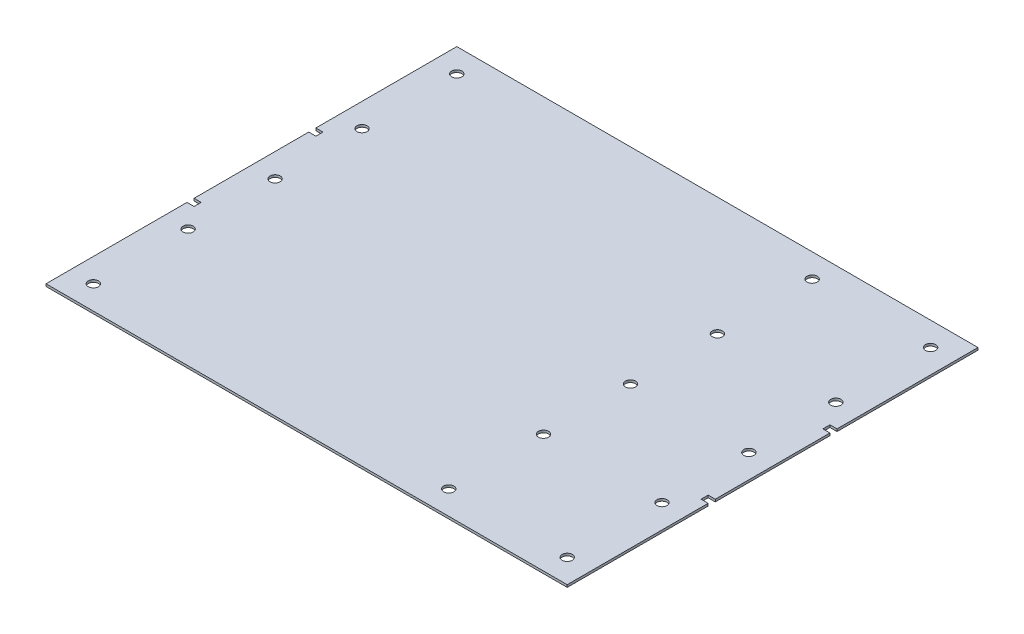
ISO-10303-21;
HEADER;
FILE_DESCRIPTION(('STEP AP214'),'2;1');
FILE_NAME('part.step','',(''),(''),'','','');
FILE_SCHEMA(('AUTOMOTIVE_DESIGN { 1 0 10303 214 1 1 1 1 }'));
ENDSEC;
DATA;
#1=APPLICATION_CONTEXT('core data for automotive mechanical design processes');
#2=APPLICATION_PROTOCOL_DEFINITION('international standard','automotive_design',2000,#1);
#3=PRODUCT_CONTEXT('',#1,'mechanical');
#4=PRODUCT('Part','Part','',(#3));
#5=PRODUCT_RELATED_PRODUCT_CATEGORY('part','',(#4));
#6=PRODUCT_DEFINITION_FORMATION('','',#4);
#7=PRODUCT_DEFINITION_CONTEXT('part definition',#1,'design');
#8=PRODUCT_DEFINITION('design','',#6,#7);
#9=PRODUCT_DEFINITION_SHAPE('','',#8);
#10=(LENGTH_UNIT() NAMED_UNIT(*) SI_UNIT(.MILLI.,.METRE.));
#11=(NAMED_UNIT(*) PLANE_ANGLE_UNIT() SI_UNIT($,.RADIAN.));
#12=(NAMED_UNIT(*) SI_UNIT($,.STERADIAN.) SOLID_ANGLE_UNIT());
#13=UNCERTAINTY_MEASURE_WITH_UNIT(LENGTH_MEASURE(1.E-05),#10,'distance_accuracy_value','');
#14=(GEOMETRIC_REPRESENTATION_CONTEXT(3) GLOBAL_UNCERTAINTY_ASSIGNED_CONTEXT((#13)) GLOBAL_UNIT_ASSIGNED_CONTEXT((#10,
#11,#12)) REPRESENTATION_CONTEXT('',''));
#15=CARTESIAN_POINT('',(0.,0.,0.));
#16=DIRECTION('',(0.,0.,1.));
#17=DIRECTION('',(1.,0.,0.));
#18=AXIS2_PLACEMENT_3D('',#15,#16,#17);
#19=CARTESIAN_POINT('',(207.,1.,1.91513471747838E-12));
#20=DIRECTION('',(1.,0.,0.));
#21=DIRECTION('',(0.,0.,-1.));
#22=AXIS2_PLACEMENT_3D('',#19,#20,#21);
#23=PLANE('',#22);
#24=DIRECTION('',(0.,0.,1.));
#25=VECTOR('',#24,1.);
#26=CARTESIAN_POINT('',(207.,0.,1.91513471747838E-12));
#27=LINE('',#26,#25);
#28=CARTESIAN_POINT('',(207.,0.,24.2));
#29=VERTEX_POINT('',#28);
#30=CARTESIAN_POINT('',(207.,0.,27.2));
#31=VERTEX_POINT('',#30);
#32=EDGE_CURVE('E251',#29,#31,#27,.T.);
#33=ORIENTED_EDGE('',*,*,#32,.F.);
#34=DIRECTION('',(0.,-1.,0.));
#35=VECTOR('',#34,1.);
#36=CARTESIAN_POINT('',(207.,1.,24.2));
#37=LINE('',#36,#35);
#38=CARTESIAN_POINT('',(207.,1.,24.2));
#39=VERTEX_POINT('',#38);
#40=EDGE_CURVE('E11',#39,#29,#37,.T.);
#41=ORIENTED_EDGE('',*,*,#40,.F.);
#42=DIRECTION('',(0.,0.,1.));
#43=VECTOR('',#42,1.);
#44=CARTESIAN_POINT('',(207.,1.,1.91513471747838E-12));
#45=LINE('',#44,#43);
#46=CARTESIAN_POINT('',(207.,1.,27.2));
#47=VERTEX_POINT('',#46);
#48=EDGE_CURVE('E820',#39,#47,#45,.T.);
#49=ORIENTED_EDGE('',*,*,#48,.T.);
#50=DIRECTION('',(0.,-1.,0.));
#51=VECTOR('',#50,1.);
#52=CARTESIAN_POINT('',(207.,1.,27.2));
#53=LINE('',#52,#51);
#54=EDGE_CURVE('E53',#47,#31,#53,.T.);
#55=ORIENTED_EDGE('',*,*,#54,.T.);
#56=EDGE_LOOP('',(#33,#41,#49,#55));
#57=FACE_BOUND('',#56,.T.);
#58=ADVANCED_FACE('F36',(#57),#23,.T.);
#59=CARTESIAN_POINT('',(0.,1.,24.2));
#60=DIRECTION('',(0.,0.,1.));
#61=DIRECTION('',(1.,0.,0.));
#62=AXIS2_PLACEMENT_3D('',#59,#60,#61);
#63=PLANE('',#62);
#64=DIRECTION('',(-1.,0.,0.));
#65=VECTOR('',#64,1.);
#66=CARTESIAN_POINT('',(0.,0.,24.2));
#67=LINE('',#66,#65);
#68=CARTESIAN_POINT('',(210.,0.,24.2));
#69=VERTEX_POINT('',#68);
#70=EDGE_CURVE('E248',#69,#29,#67,.T.);
#71=ORIENTED_EDGE('',*,*,#70,.F.);
#72=DIRECTION('',(0.,-1.,0.));
#73=VECTOR('',#72,1.);
#74=CARTESIAN_POINT('',(210.,1.,24.2));
#75=LINE('',#74,#73);
#76=CARTESIAN_POINT('',(210.,1.,24.2));
#77=VERTEX_POINT('',#76);
#78=EDGE_CURVE('E45',#77,#69,#75,.T.);
#79=ORIENTED_EDGE('',*,*,#78,.F.);
#80=DIRECTION('',(-1.,0.,0.));
#81=VECTOR('',#80,1.);
#82=CARTESIAN_POINT('',(0.,1.,24.2));
#83=LINE('',#82,#81);
#84=EDGE_CURVE('E818',#77,#39,#83,.T.);
#85=ORIENTED_EDGE('',*,*,#84,.T.);
#86=ORIENTED_EDGE('',*,*,#40,.T.);
#87=EDGE_LOOP('',(#71,#79,#85,#86));
#88=FACE_BOUND('',#87,.T.);
#89=ADVANCED_FACE('F249',(#88),#63,.T.);
#90=CARTESIAN_POINT('',(210.,1.,0.));
#91=DIRECTION('',(1.,0.,0.));
#92=DIRECTION('',(0.,0.,-1.));
#93=AXIS2_PLACEMENT_3D('',#90,#91,#92);
#94=PLANE('',#93);
#95=DIRECTION('',(0.,0.,1.));
#96=VECTOR('',#95,1.);
#97=CARTESIAN_POINT('',(210.,0.,0.));
#98=LINE('',#97,#96);
#99=CARTESIAN_POINT('',(210.,0.,-24.2));
#100=VERTEX_POINT('',#99);
#101=EDGE_CURVE('E240',#100,#69,#98,.T.);
#102=ORIENTED_EDGE('',*,*,#101,.F.);
#103=DIRECTION('',(0.,-1.,0.));
#104=VECTOR('',#103,1.);
#105=CARTESIAN_POINT('',(210.,1.,-24.2));
#106=LINE('',#105,#104);
#107=CARTESIAN_POINT('',(210.,1.,-24.2));
#108=VERTEX_POINT('',#107);
#109=EDGE_CURVE('E233',#108,#100,#106,.T.);
#110=ORIENTED_EDGE('',*,*,#109,.F.);
#111=DIRECTION('',(0.,0.,1.));
#112=VECTOR('',#111,1.);
#113=CARTESIAN_POINT('',(210.,1.,0.));
#114=LINE('',#113,#112);
#115=EDGE_CURVE('E243',#108,#77,#114,.T.);
#116=ORIENTED_EDGE('',*,*,#115,.T.);
#117=ORIENTED_EDGE('',*,*,#78,.T.);
#118=EDGE_LOOP('',(#102,#110,#116,#117));
#119=FACE_BOUND('',#118,.T.);
#120=ADVANCED_FACE('F238',(#119),#94,.T.);
#121=CARTESIAN_POINT('',(0.,1.,-24.2));
#122=DIRECTION('',(0.,0.,-1.));
#123=DIRECTION('',(-1.,0.,0.));
#124=AXIS2_PLACEMENT_3D('',#121,#122,#123);
#125=PLANE('',#124);
#126=DIRECTION('',(1.,0.,0.));
#127=VECTOR('',#126,1.);
#128=CARTESIAN_POINT('',(0.,0.,-24.2));
#129=LINE('',#128,#127);
#130=CARTESIAN_POINT('',(207.,0.,-24.2));
#131=VERTEX_POINT('',#130);
#132=EDGE_CURVE('E256',#131,#100,#129,.T.);
#133=ORIENTED_EDGE('',*,*,#132,.F.);
#134=DIRECTION('',(0.,-1.,0.));
#135=VECTOR('',#134,1.);
#136=CARTESIAN_POINT('',(207.,1.,-24.2));
#137=LINE('',#136,#135);
#138=CARTESIAN_POINT('',(207.,1.,-24.2));
#139=VERTEX_POINT('',#138);
#140=EDGE_CURVE('E231',#139,#131,#137,.T.);
#141=ORIENTED_EDGE('',*,*,#140,.F.);
#142=DIRECTION('',(1.,0.,0.));
#143=VECTOR('',#142,1.);
#144=CARTESIAN_POINT('',(0.,1.,-24.2));
#145=LINE('',#144,#143);
#146=EDGE_CURVE('E765',#139,#108,#145,.T.);
#147=ORIENTED_EDGE('',*,*,#146,.T.);
#148=ORIENTED_EDGE('',*,*,#109,.T.);
#149=EDGE_LOOP('',(#133,#141,#147,#148));
#150=FACE_BOUND('',#149,.T.);
#151=ADVANCED_FACE('F724',(#150),#125,.T.);
#152=CARTESIAN_POINT('',(207.,1.,-1.91513471747838E-12));
#153=DIRECTION('',(1.,0.,0.));
#154=DIRECTION('',(0.,0.,-1.));
#155=AXIS2_PLACEMENT_3D('',#152,#153,#154);
#156=PLANE('',#155);
#157=DIRECTION('',(0.,0.,1.));
#158=VECTOR('',#157,1.);
#159=CARTESIAN_POINT('',(207.,0.,-1.91513471747838E-12));
#160=LINE('',#159,#158);
#161=CARTESIAN_POINT('',(207.,0.,-27.2));
#162=VERTEX_POINT('',#161);
#163=EDGE_CURVE('E258',#162,#131,#160,.T.);
#164=ORIENTED_EDGE('',*,*,#163,.F.);
#165=DIRECTION('',(0.,-1.,0.));
#166=VECTOR('',#165,1.);
#167=CARTESIAN_POINT('',(207.,1.,-27.2));
#168=LINE('',#167,#166);
#169=CARTESIAN_POINT('',(207.,1.,-27.2));
#170=VERTEX_POINT('',#169);
#171=EDGE_CURVE('E229',#170,#162,#168,.T.);
#172=ORIENTED_EDGE('',*,*,#171,.F.);
#173=DIRECTION('',(0.,0.,1.));
#174=VECTOR('',#173,1.);
#175=CARTESIAN_POINT('',(207.,1.,-1.91513471747838E-12));
#176=LINE('',#175,#174);
#177=EDGE_CURVE('E761',#170,#139,#176,.T.);
#178=ORIENTED_EDGE('',*,*,#177,.T.);
#179=ORIENTED_EDGE('',*,*,#140,.T.);
#180=EDGE_LOOP('',(#164,#172,#178,#179));
#181=FACE_BOUND('',#180,.T.);
#182=ADVANCED_FACE('F714',(#181),#156,.T.);
#183=CARTESIAN_POINT('',(-2.20194233217307E-13,1.,-27.1999999999984));
#184=DIRECTION('',(0.,0.,1.));
#185=DIRECTION('',(1.,0.,0.));
#186=AXIS2_PLACEMENT_3D('',#183,#184,#185);
#187=PLANE('',#186);
#188=DIRECTION('',(-1.,0.,0.));
#189=VECTOR('',#188,1.);
#190=CARTESIAN_POINT('',(-2.20194233217307E-13,0.,-27.1999999999984));
#191=LINE('',#190,#189);
#192=CARTESIAN_POINT('',(210.,0.,-27.2000000000001));
#193=VERTEX_POINT('',#192);
#194=EDGE_CURVE('E263',#193,#162,#191,.T.);
#195=ORIENTED_EDGE('',*,*,#194,.F.);
#196=DIRECTION('',(0.,-1.,0.));
#197=VECTOR('',#196,1.);
#198=CARTESIAN_POINT('',(210.,1.,-27.2000000000001));
#199=LINE('',#198,#197);
#200=CARTESIAN_POINT('',(210.,1.,-27.2000000000001));
#201=VERTEX_POINT('',#200);
#202=EDGE_CURVE('E227',#201,#193,#199,.T.);
#203=ORIENTED_EDGE('',*,*,#202,.F.);
#204=DIRECTION('',(-1.,0.,0.));
#205=VECTOR('',#204,1.);
#206=CARTESIAN_POINT('',(-2.20194233217307E-13,1.,-27.1999999999984));
#207=LINE('',#206,#205);
#208=EDGE_CURVE('E764',#201,#170,#207,.T.);
#209=ORIENTED_EDGE('',*,*,#208,.T.);
#210=ORIENTED_EDGE('',*,*,#171,.T.);
#211=EDGE_LOOP('',(#195,#203,#209,#210));
#212=FACE_BOUND('',#211,.T.);
#213=ADVANCED_FACE('F704',(#212),#187,.T.);
#214=CARTESIAN_POINT('',(210.,1.,-1.95921710227969E-13));
#215=DIRECTION('',(1.,0.,0.));
#216=DIRECTION('',(0.,0.,-1.));
#217=AXIS2_PLACEMENT_3D('',#214,#215,#216);
#218=PLANE('',#217);
#219=DIRECTION('',(0.,0.,1.));
#220=VECTOR('',#219,1.);
#221=CARTESIAN_POINT('',(210.,0.,-1.95921710227969E-13));
#222=LINE('',#221,#220);
#223=CARTESIAN_POINT('',(210.,0.,-86.7000000000001));
#224=VERTEX_POINT('',#223);
#225=EDGE_CURVE('E266',#224,#193,#222,.T.);
#226=ORIENTED_EDGE('',*,*,#225,.F.);
#227=DIRECTION('',(0.,-1.,0.));
#228=VECTOR('',#227,1.);
#229=CARTESIAN_POINT('',(210.,1.,-86.7000000000001));
#230=LINE('',#229,#228);
#231=CARTESIAN_POINT('',(210.,1.,-86.7000000000001));
#232=VERTEX_POINT('',#231);
#233=EDGE_CURVE('E225',#232,#224,#230,.T.);
#234=ORIENTED_EDGE('',*,*,#233,.F.);
#235=DIRECTION('',(0.,0.,1.));
#236=VECTOR('',#235,1.);
#237=CARTESIAN_POINT('',(210.,1.,-1.95921710227969E-13));
#238=LINE('',#237,#236);
#239=EDGE_CURVE('E767',#232,#201,#238,.T.);
#240=ORIENTED_EDGE('',*,*,#239,.T.);
#241=ORIENTED_EDGE('',*,*,#202,.T.);
#242=EDGE_LOOP('',(#226,#234,#240,#241));
#243=FACE_BOUND('',#242,.T.);
#244=ADVANCED_FACE('F694',(#243),#218,.T.);
#245=CARTESIAN_POINT('',(0.,1.,-86.7));
#246=DIRECTION('',(0.,0.,-1.));
#247=DIRECTION('',(-1.,0.,0.));
#248=AXIS2_PLACEMENT_3D('',#245,#246,#247);
#249=PLANE('',#248);
#250=DIRECTION('',(1.,0.,0.));
#251=VECTOR('',#250,1.);
#252=CARTESIAN_POINT('',(0.,0.,-86.7));
#253=LINE('',#252,#251);
#254=CARTESIAN_POINT('',(-10.,0.,-86.7));
#255=VERTEX_POINT('',#254);
#256=EDGE_CURVE('E269',#255,#224,#253,.T.);
#257=ORIENTED_EDGE('',*,*,#256,.F.);
#258=DIRECTION('',(0.,-1.,0.));
#259=VECTOR('',#258,1.);
#260=CARTESIAN_POINT('',(-10.,1.,-86.7));
#261=LINE('',#260,#259);
#262=CARTESIAN_POINT('',(-10.,1.,-86.7));
#263=VERTEX_POINT('',#262);
#264=EDGE_CURVE('E223',#263,#255,#261,.T.);
#265=ORIENTED_EDGE('',*,*,#264,.F.);
#266=DIRECTION('',(1.,0.,0.));
#267=VECTOR('',#266,1.);
#268=CARTESIAN_POINT('',(0.,1.,-86.7));
#269=LINE('',#268,#267);
#270=EDGE_CURVE('E774',#263,#232,#269,.T.);
#271=ORIENTED_EDGE('',*,*,#270,.T.);
#272=ORIENTED_EDGE('',*,*,#233,.T.);
#273=EDGE_LOOP('',(#257,#265,#271,#272));
#274=FACE_BOUND('',#273,.T.);
#275=ADVANCED_FACE('F684',(#274),#249,.T.);
#276=CARTESIAN_POINT('',(-10.,1.,0.));
#277=DIRECTION('',(-1.,0.,0.));
#278=DIRECTION('',(0.,0.,1.));
#279=AXIS2_PLACEMENT_3D('',#276,#277,#278);
#280=PLANE('',#279);
#281=DIRECTION('',(0.,0.,-1.));
#282=VECTOR('',#281,1.);
#283=CARTESIAN_POINT('',(-10.,0.,0.));
#284=LINE('',#283,#282);
#285=CARTESIAN_POINT('',(-10.,0.,-27.2));
#286=VERTEX_POINT('',#285);
#287=EDGE_CURVE('E272',#286,#255,#284,.T.);
#288=ORIENTED_EDGE('',*,*,#287,.F.);
#289=DIRECTION('',(0.,-1.,0.));
#290=VECTOR('',#289,1.);
#291=CARTESIAN_POINT('',(-10.,1.,-27.2));
#292=LINE('',#291,#290);
#293=CARTESIAN_POINT('',(-10.,1.,-27.2));
#294=VERTEX_POINT('',#293);
#295=EDGE_CURVE('E221',#294,#286,#292,.T.);
#296=ORIENTED_EDGE('',*,*,#295,.F.);
#297=DIRECTION('',(0.,0.,-1.));
#298=VECTOR('',#297,1.);
#299=CARTESIAN_POINT('',(-10.,1.,0.));
#300=LINE('',#299,#298);
#301=EDGE_CURVE('E777',#294,#263,#300,.T.);
#302=ORIENTED_EDGE('',*,*,#301,.T.);
#303=ORIENTED_EDGE('',*,*,#264,.T.);
#304=EDGE_LOOP('',(#288,#296,#302,#303));
#305=FACE_BOUND('',#304,.T.);
#306=ADVANCED_FACE('F674',(#305),#280,.T.);
#307=CARTESIAN_POINT('',(0.,1.,-27.2));
#308=DIRECTION('',(0.,0.,1.));
#309=DIRECTION('',(1.,0.,0.));
#310=AXIS2_PLACEMENT_3D('',#307,#308,#309);
#311=PLANE('',#310);
#312=DIRECTION('',(-1.,0.,0.));
#313=VECTOR('',#312,1.);
#314=CARTESIAN_POINT('',(0.,0.,-27.2));
#315=LINE('',#314,#313);
#316=CARTESIAN_POINT('',(-7.,0.,-27.2));
#317=VERTEX_POINT('',#316);
#318=EDGE_CURVE('E275',#317,#286,#315,.T.);
#319=ORIENTED_EDGE('',*,*,#318,.F.);
#320=DIRECTION('',(0.,-1.,0.));
#321=VECTOR('',#320,1.);
#322=CARTESIAN_POINT('',(-7.,1.,-27.2));
#323=LINE('',#322,#321);
#324=CARTESIAN_POINT('',(-7.,1.,-27.2));
#325=VERTEX_POINT('',#324);
#326=EDGE_CURVE('E219',#325,#317,#323,.T.);
#327=ORIENTED_EDGE('',*,*,#326,.F.);
#328=DIRECTION('',(-1.,0.,0.));
#329=VECTOR('',#328,1.);
#330=CARTESIAN_POINT('',(0.,1.,-27.2));
#331=LINE('',#330,#329);
#332=EDGE_CURVE('E780',#325,#294,#331,.T.);
#333=ORIENTED_EDGE('',*,*,#332,.T.);
#334=ORIENTED_EDGE('',*,*,#295,.T.);
#335=EDGE_LOOP('',(#319,#327,#333,#334));
#336=FACE_BOUND('',#335,.T.);
#337=ADVANCED_FACE('F664',(#336),#311,.T.);
#338=CARTESIAN_POINT('',(-6.99999999999999,1.,0.));
#339=DIRECTION('',(1.,0.,0.));
#340=DIRECTION('',(0.,0.,-1.));
#341=AXIS2_PLACEMENT_3D('',#338,#339,#340);
#342=PLANE('',#341);
#343=DIRECTION('',(0.,0.,1.));
#344=VECTOR('',#343,1.);
#345=CARTESIAN_POINT('',(-6.99999999999999,0.,0.));
#346=LINE('',#345,#344);
#347=CARTESIAN_POINT('',(-7.,0.,-24.2));
#348=VERTEX_POINT('',#347);
#349=EDGE_CURVE('E278',#317,#348,#346,.T.);
#350=ORIENTED_EDGE('',*,*,#349,.T.);
#351=DIRECTION('',(0.,-1.,0.));
#352=VECTOR('',#351,1.);
#353=CARTESIAN_POINT('',(-7.,1.,-24.2));
#354=LINE('',#353,#352);
#355=CARTESIAN_POINT('',(-7.,1.,-24.2));
#356=VERTEX_POINT('',#355);
#357=EDGE_CURVE('E216',#356,#348,#354,.T.);
#358=ORIENTED_EDGE('',*,*,#357,.F.);
#359=DIRECTION('',(0.,0.,1.));
#360=VECTOR('',#359,1.);
#361=CARTESIAN_POINT('',(-6.99999999999999,1.,0.));
#362=LINE('',#361,#360);
#363=EDGE_CURVE('E783',#325,#356,#362,.T.);
#364=ORIENTED_EDGE('',*,*,#363,.F.);
#365=ORIENTED_EDGE('',*,*,#326,.T.);
#366=EDGE_LOOP('',(#350,#358,#364,#365));
#367=FACE_BOUND('',#366,.T.);
#368=ADVANCED_FACE('F654',(#367),#342,.F.);
#369=CARTESIAN_POINT('',(-6.15711185740036E-13,1.,-24.2000000000002));
#370=DIRECTION('',(0.,0.,1.));
#371=DIRECTION('',(1.,0.,0.));
#372=AXIS2_PLACEMENT_3D('',#369,#370,#371);
#373=PLANE('',#372);
#374=DIRECTION('',(-1.,0.,0.));
#375=VECTOR('',#374,1.);
#376=CARTESIAN_POINT('',(-6.15711185740036E-13,0.,-24.2000000000002));
#377=LINE('',#376,#375);
#378=CARTESIAN_POINT('',(-10.,0.,-24.2));
#379=VERTEX_POINT('',#378);
#380=EDGE_CURVE('E281',#348,#379,#377,.T.);
#381=ORIENTED_EDGE('',*,*,#380,.T.);
#382=DIRECTION('',(0.,-1.,0.));
#383=VECTOR('',#382,1.);
#384=CARTESIAN_POINT('',(-10.,1.,-24.2));
#385=LINE('',#384,#383);
#386=CARTESIAN_POINT('',(-10.,1.,-24.2));
#387=VERTEX_POINT('',#386);
#388=EDGE_CURVE('E213',#387,#379,#385,.T.);
#389=ORIENTED_EDGE('',*,*,#388,.F.);
#390=DIRECTION('',(-1.,0.,0.));
#391=VECTOR('',#390,1.);
#392=CARTESIAN_POINT('',(-6.15711185740036E-13,1.,-24.2000000000002));
#393=LINE('',#392,#391);
#394=EDGE_CURVE('E786',#356,#387,#393,.T.);
#395=ORIENTED_EDGE('',*,*,#394,.F.);
#396=ORIENTED_EDGE('',*,*,#357,.T.);
#397=EDGE_LOOP('',(#381,#389,#395,#396));
#398=FACE_BOUND('',#397,.T.);
#399=ADVANCED_FACE('F644',(#398),#373,.F.);
#400=CARTESIAN_POINT('',(-10.,1.,0.));
#401=DIRECTION('',(1.,0.,0.));
#402=DIRECTION('',(0.,0.,-1.));
#403=AXIS2_PLACEMENT_3D('',#400,#401,#402);
#404=PLANE('',#403);
#405=DIRECTION('',(0.,0.,1.));
#406=VECTOR('',#405,1.);
#407=CARTESIAN_POINT('',(-10.,0.,0.));
#408=LINE('',#407,#406);
#409=CARTESIAN_POINT('',(-10.,0.,24.2));
#410=VERTEX_POINT('',#409);
#411=EDGE_CURVE('E284',#379,#410,#408,.T.);
#412=ORIENTED_EDGE('',*,*,#411,.T.);
#413=DIRECTION('',(0.,-1.,0.));
#414=VECTOR('',#413,1.);
#415=CARTESIAN_POINT('',(-10.,1.,24.2));
#416=LINE('',#415,#414);
#417=CARTESIAN_POINT('',(-10.,1.,24.2));
#418=VERTEX_POINT('',#417);
#419=EDGE_CURVE('E210',#418,#410,#416,.T.);
#420=ORIENTED_EDGE('',*,*,#419,.F.);
#421=DIRECTION('',(0.,0.,1.));
#422=VECTOR('',#421,1.);
#423=CARTESIAN_POINT('',(-10.,1.,0.));
#424=LINE('',#423,#422);
#425=EDGE_CURVE('E789',#387,#418,#424,.T.);
#426=ORIENTED_EDGE('',*,*,#425,.F.);
#427=ORIENTED_EDGE('',*,*,#388,.T.);
#428=EDGE_LOOP('',(#412,#420,#426,#427));
#429=FACE_BOUND('',#428,.T.);
#430=ADVANCED_FACE('F634',(#429),#404,.F.);
#431=CARTESIAN_POINT('',(-6.15711185740036E-13,1.,24.2000000000002));
#432=DIRECTION('',(0.,0.,-1.));
#433=DIRECTION('',(-1.,0.,0.));
#434=AXIS2_PLACEMENT_3D('',#431,#432,#433);
#435=PLANE('',#434);
#436=DIRECTION('',(1.,0.,0.));
#437=VECTOR('',#436,1.);
#438=CARTESIAN_POINT('',(-6.15711185740036E-13,0.,24.2000000000002));
#439=LINE('',#438,#437);
#440=CARTESIAN_POINT('',(-6.99999999999999,0.,24.2));
#441=VERTEX_POINT('',#440);
#442=EDGE_CURVE('E287',#410,#441,#439,.T.);
#443=ORIENTED_EDGE('',*,*,#442,.T.);
#444=DIRECTION('',(0.,-1.,0.));
#445=VECTOR('',#444,1.);
#446=CARTESIAN_POINT('',(-6.99999999999999,1.,24.2));
#447=LINE('',#446,#445);
#448=CARTESIAN_POINT('',(-6.99999999999999,1.,24.2));
#449=VERTEX_POINT('',#448);
#450=EDGE_CURVE('E207',#449,#441,#447,.T.);
#451=ORIENTED_EDGE('',*,*,#450,.F.);
#452=DIRECTION('',(1.,0.,0.));
#453=VECTOR('',#452,1.);
#454=CARTESIAN_POINT('',(-6.15711185740036E-13,1.,24.2000000000002));
#455=LINE('',#454,#453);
#456=EDGE_CURVE('E792',#418,#449,#455,.T.);
#457=ORIENTED_EDGE('',*,*,#456,.F.);
#458=ORIENTED_EDGE('',*,*,#419,.T.);
#459=EDGE_LOOP('',(#443,#451,#457,#458));
#460=FACE_BOUND('',#459,.T.);
#461=ADVANCED_FACE('F624',(#460),#435,.F.);
#462=CARTESIAN_POINT('',(-6.99999999999999,1.,0.));
#463=DIRECTION('',(1.,0.,0.));
#464=DIRECTION('',(0.,0.,-1.));
#465=AXIS2_PLACEMENT_3D('',#462,#463,#464);
#466=PLANE('',#465);
#467=DIRECTION('',(0.,0.,1.));
#468=VECTOR('',#467,1.);
#469=CARTESIAN_POINT('',(-6.99999999999999,0.,0.));
#470=LINE('',#469,#468);
#471=CARTESIAN_POINT('',(-6.99999999999999,0.,27.2));
#472=VERTEX_POINT('',#471);
#473=EDGE_CURVE('E290',#441,#472,#470,.T.);
#474=ORIENTED_EDGE('',*,*,#473,.T.);
#475=DIRECTION('',(0.,-1.,0.));
#476=VECTOR('',#475,1.);
#477=CARTESIAN_POINT('',(-6.99999999999999,1.,27.2));
#478=LINE('',#477,#476);
#479=CARTESIAN_POINT('',(-6.99999999999999,1.,27.2));
#480=VERTEX_POINT('',#479);
#481=EDGE_CURVE('E205',#480,#472,#478,.T.);
#482=ORIENTED_EDGE('',*,*,#481,.F.);
#483=DIRECTION('',(0.,0.,1.));
#484=VECTOR('',#483,1.);
#485=CARTESIAN_POINT('',(-6.99999999999999,1.,0.));
#486=LINE('',#485,#484);
#487=EDGE_CURVE('E795',#449,#480,#486,.T.);
#488=ORIENTED_EDGE('',*,*,#487,.F.);
#489=ORIENTED_EDGE('',*,*,#450,.T.);
#490=EDGE_LOOP('',(#474,#482,#488,#489));
#491=FACE_BOUND('',#490,.T.);
#492=ADVANCED_FACE('F614',(#491),#466,.F.);
#493=CARTESIAN_POINT('',(0.,1.,27.2000000000001));
#494=DIRECTION('',(0.,0.,-1.));
#495=DIRECTION('',(-1.,0.,0.));
#496=AXIS2_PLACEMENT_3D('',#493,#494,#495);
#497=PLANE('',#496);
#498=DIRECTION('',(1.,0.,0.));
#499=VECTOR('',#498,1.);
#500=CARTESIAN_POINT('',(0.,0.,27.2000000000001));
#501=LINE('',#500,#499);
#502=CARTESIAN_POINT('',(-9.99999999999999,0.,27.2));
#503=VERTEX_POINT('',#502);
#504=EDGE_CURVE('E293',#503,#472,#501,.T.);
#505=ORIENTED_EDGE('',*,*,#504,.F.);
#506=DIRECTION('',(0.,-1.,0.));
#507=VECTOR('',#506,1.);
#508=CARTESIAN_POINT('',(-9.99999999999999,1.,27.2));
#509=LINE('',#508,#507);
#510=CARTESIAN_POINT('',(-9.99999999999999,1.,27.2));
#511=VERTEX_POINT('',#510);
#512=EDGE_CURVE('E199',#511,#503,#509,.T.);
#513=ORIENTED_EDGE('',*,*,#512,.F.);
#514=DIRECTION('',(1.,0.,0.));
#515=VECTOR('',#514,1.);
#516=CARTESIAN_POINT('',(0.,1.,27.2000000000001));
#517=LINE('',#516,#515);
#518=EDGE_CURVE('E797',#511,#480,#517,.T.);
#519=ORIENTED_EDGE('',*,*,#518,.T.);
#520=ORIENTED_EDGE('',*,*,#481,.T.);
#521=EDGE_LOOP('',(#505,#513,#519,#520));
#522=FACE_BOUND('',#521,.T.);
#523=ADVANCED_FACE('F604',(#522),#497,.T.);
#524=CARTESIAN_POINT('',(-10.,1.,0.));
#525=DIRECTION('',(1.,0.,0.));
#526=DIRECTION('',(0.,0.,-1.));
#527=AXIS2_PLACEMENT_3D('',#524,#525,#526);
#528=PLANE('',#527);
#529=DIRECTION('',(0.,0.,1.));
#530=VECTOR('',#529,1.);
#531=CARTESIAN_POINT('',(-10.,0.,0.));
#532=LINE('',#531,#530);
#533=CARTESIAN_POINT('',(-9.99999999999998,0.,86.7));
#534=VERTEX_POINT('',#533);
#535=EDGE_CURVE('E296',#503,#534,#532,.T.);
#536=ORIENTED_EDGE('',*,*,#535,.T.);
#537=DIRECTION('',(0.,-1.,0.));
#538=VECTOR('',#537,1.);
#539=CARTESIAN_POINT('',(-9.99999999999998,1.,86.7));
#540=LINE('',#539,#538);
#541=CARTESIAN_POINT('',(-9.99999999999998,1.,86.7));
#542=VERTEX_POINT('',#541);
#543=EDGE_CURVE('E197',#542,#534,#540,.T.);
#544=ORIENTED_EDGE('',*,*,#543,.F.);
#545=DIRECTION('',(0.,0.,1.));
#546=VECTOR('',#545,1.);
#547=CARTESIAN_POINT('',(-10.,1.,0.));
#548=LINE('',#547,#546);
#549=EDGE_CURVE('E190',#511,#542,#548,.T.);
#550=ORIENTED_EDGE('',*,*,#549,.F.);
#551=ORIENTED_EDGE('',*,*,#512,.T.);
#552=EDGE_LOOP('',(#536,#544,#550,#551));
#553=FACE_BOUND('',#552,.T.);
#554=ADVANCED_FACE('F595',(#553),#528,.F.);
#555=CARTESIAN_POINT('',(0.,1.,86.7));
#556=DIRECTION('',(0.,0.,-1.));
#557=DIRECTION('',(-1.,0.,0.));
#558=AXIS2_PLACEMENT_3D('',#555,#556,#557);
#559=PLANE('',#558);
#560=DIRECTION('',(1.,0.,0.));
#561=VECTOR('',#560,1.);
#562=CARTESIAN_POINT('',(0.,0.,86.7));
#563=LINE('',#562,#561);
#564=CARTESIAN_POINT('',(210.,0.,86.7));
#565=VERTEX_POINT('',#564);
#566=EDGE_CURVE('E196',#534,#565,#563,.T.);
#567=ORIENTED_EDGE('',*,*,#566,.T.);
#568=DIRECTION('',(0.,-1.,0.));
#569=VECTOR('',#568,1.);
#570=CARTESIAN_POINT('',(210.,1.,86.7));
#571=LINE('',#570,#569);
#572=CARTESIAN_POINT('',(210.,1.,86.7));
#573=VERTEX_POINT('',#572);
#574=EDGE_CURVE('E179',#573,#565,#571,.T.);
#575=ORIENTED_EDGE('',*,*,#574,.F.);
#576=DIRECTION('',(1.,0.,0.));
#577=VECTOR('',#576,1.);
#578=CARTESIAN_POINT('',(0.,1.,86.7));
#579=LINE('',#578,#577);
#580=EDGE_CURVE('E184',#542,#573,#579,.T.);
#581=ORIENTED_EDGE('',*,*,#580,.F.);
#582=ORIENTED_EDGE('',*,*,#543,.T.);
#583=EDGE_LOOP('',(#567,#575,#581,#582));
#584=FACE_BOUND('',#583,.T.);
#585=ADVANCED_FACE('F195',(#584),#559,.F.);
#586=CARTESIAN_POINT('',(210.,1.,0.));
#587=DIRECTION('',(-1.,0.,0.));
#588=DIRECTION('',(0.,0.,1.));
#589=AXIS2_PLACEMENT_3D('',#586,#587,#588);
#590=PLANE('',#589);
#591=DIRECTION('',(0.,0.,-1.));
#592=VECTOR('',#591,1.);
#593=CARTESIAN_POINT('',(210.,0.,0.));
#594=LINE('',#593,#592);
#595=CARTESIAN_POINT('',(210.,0.,27.2));
#596=VERTEX_POINT('',#595);
#597=EDGE_CURVE('E300',#565,#596,#594,.T.);
#598=ORIENTED_EDGE('',*,*,#597,.T.);
#599=DIRECTION('',(0.,-1.,0.));
#600=VECTOR('',#599,1.);
#601=CARTESIAN_POINT('',(210.,1.,27.2));
#602=LINE('',#601,#600);
#603=CARTESIAN_POINT('',(210.,1.,27.2));
#604=VERTEX_POINT('',#603);
#605=EDGE_CURVE('E115',#604,#596,#602,.T.);
#606=ORIENTED_EDGE('',*,*,#605,.F.);
#607=DIRECTION('',(0.,0.,-1.));
#608=VECTOR('',#607,1.);
#609=CARTESIAN_POINT('',(210.,1.,0.));
#610=LINE('',#609,#608);
#611=EDGE_CURVE('E175',#573,#604,#610,.T.);
#612=ORIENTED_EDGE('',*,*,#611,.F.);
#613=ORIENTED_EDGE('',*,*,#574,.T.);
#614=EDGE_LOOP('',(#598,#606,#612,#613));
#615=FACE_BOUND('',#614,.T.);
#616=ADVANCED_FACE('F177',(#615),#590,.F.);
#617=CARTESIAN_POINT('',(0.,1.,36.7));
#618=DIRECTION('',(0.,-1.,0.));
#619=DIRECTION('',(0.,0.,-1.));
#620=AXIS2_PLACEMENT_3D('',#617,#618,#619);
#621=CYLINDRICAL_SURFACE('',#620,2.15);
#622=CARTESIAN_POINT('',(0.,1.,36.7));
#623=DIRECTION('',(0.,1.,0.));
#624=DIRECTION('',(0.,0.,1.));
#625=AXIS2_PLACEMENT_3D('',#622,#623,#624);
#626=CIRCLE('',#625,2.15);
#627=CARTESIAN_POINT('',(0.,1.,38.85));
#628=VERTEX_POINT('',#627);
#629=EDGE_CURVE('E822',#628,#628,#626,.T.);
#630=ORIENTED_EDGE('',*,*,#629,.T.);
#631=EDGE_LOOP('',(#630));
#632=FACE_BOUND('',#631,.T.);
#633=CARTESIAN_POINT('',(0.,0.,36.7));
#634=DIRECTION('',(0.,1.,0.));
#635=DIRECTION('',(0.,0.,1.));
#636=AXIS2_PLACEMENT_3D('',#633,#634,#635);
#637=CIRCLE('',#636,2.15);
#638=CARTESIAN_POINT('',(0.,0.,38.85));
#639=VERTEX_POINT('',#638);
#640=EDGE_CURVE('E349',#639,#639,#637,.T.);
#641=ORIENTED_EDGE('',*,*,#640,.F.);
#642=EDGE_LOOP('',(#641));
#643=FACE_BOUND('',#642,.T.);
#644=ADVANCED_FACE('F372',(#632,#643),#621,.F.);
#645=CARTESIAN_POINT('',(0.,1.,-36.7));
#646=DIRECTION('',(0.,-1.,0.));
#647=DIRECTION('',(0.,0.,-1.));
#648=AXIS2_PLACEMENT_3D('',#645,#646,#647);
#649=CYLINDRICAL_SURFACE('',#648,2.15);
#650=CARTESIAN_POINT('',(0.,1.,-36.7));
#651=DIRECTION('',(0.,1.,0.));
#652=DIRECTION('',(0.,0.,1.));
#653=AXIS2_PLACEMENT_3D('',#650,#651,#652);
#654=CIRCLE('',#653,2.15);
#655=CARTESIAN_POINT('',(0.,1.,-34.55));
#656=VERTEX_POINT('',#655);
#657=EDGE_CURVE('E825',#656,#656,#654,.T.);
#658=ORIENTED_EDGE('',*,*,#657,.T.);
#659=EDGE_LOOP('',(#658));
#660=FACE_BOUND('',#659,.T.);
#661=CARTESIAN_POINT('',(0.,0.,-36.7));
#662=DIRECTION('',(0.,1.,0.));
#663=DIRECTION('',(0.,0.,1.));
#664=AXIS2_PLACEMENT_3D('',#661,#662,#663);
#665=CIRCLE('',#664,2.15);
#666=CARTESIAN_POINT('',(0.,0.,-34.55));
#667=VERTEX_POINT('',#666);
#668=EDGE_CURVE('E346',#667,#667,#665,.T.);
#669=ORIENTED_EDGE('',*,*,#668,.F.);
#670=EDGE_LOOP('',(#669));
#671=FACE_BOUND('',#670,.T.);
#672=ADVANCED_FACE('F375',(#660,#671),#649,.F.);
#673=CARTESIAN_POINT('',(0.,1.,76.7));
#674=DIRECTION('',(0.,-1.,0.));
#675=DIRECTION('',(0.,0.,-1.));
#676=AXIS2_PLACEMENT_3D('',#673,#674,#675);
#677=CYLINDRICAL_SURFACE('',#676,2.15);
#678=CARTESIAN_POINT('',(0.,1.,76.7));
#679=DIRECTION('',(0.,1.,0.));
#680=DIRECTION('',(0.,0.,1.));
#681=AXIS2_PLACEMENT_3D('',#678,#679,#680);
#682=CIRCLE('',#681,2.15);
#683=CARTESIAN_POINT('',(0.,1.,78.8500000000001));
#684=VERTEX_POINT('',#683);
#685=EDGE_CURVE('E828',#684,#684,#682,.T.);
#686=ORIENTED_EDGE('',*,*,#685,.T.);
#687=EDGE_LOOP('',(#686));
#688=FACE_BOUND('',#687,.T.);
#689=CARTESIAN_POINT('',(0.,0.,76.7));
#690=DIRECTION('',(0.,1.,0.));
#691=DIRECTION('',(0.,0.,1.));
#692=AXIS2_PLACEMENT_3D('',#689,#690,#691);
#693=CIRCLE('',#692,2.15);
#694=CARTESIAN_POINT('',(0.,0.,78.8500000000001));
#695=VERTEX_POINT('',#694);
#696=EDGE_CURVE('E343',#695,#695,#693,.T.);
#697=ORIENTED_EDGE('',*,*,#696,.F.);
#698=EDGE_LOOP('',(#697));
#699=FACE_BOUND('',#698,.T.);
#700=ADVANCED_FACE('F379',(#688,#699),#677,.F.);
#701=CARTESIAN_POINT('',(0.,1.,-76.7));
#702=DIRECTION('',(0.,-1.,0.));
#703=DIRECTION('',(0.,0.,-1.));
#704=AXIS2_PLACEMENT_3D('',#701,#702,#703);
#705=CYLINDRICAL_SURFACE('',#704,2.15);
#706=CARTESIAN_POINT('',(0.,1.,-76.7));
#707=DIRECTION('',(0.,1.,0.));
#708=DIRECTION('',(0.,0.,1.));
#709=AXIS2_PLACEMENT_3D('',#706,#707,#708);
#710=CIRCLE('',#709,2.15);
#711=CARTESIAN_POINT('',(0.,1.,-74.55));
#712=VERTEX_POINT('',#711);
#713=EDGE_CURVE('E831',#712,#712,#710,.T.);
#714=ORIENTED_EDGE('',*,*,#713,.T.);
#715=EDGE_LOOP('',(#714));
#716=FACE_BOUND('',#715,.T.);
#717=CARTESIAN_POINT('',(0.,0.,-76.7));
#718=DIRECTION('',(0.,1.,0.));
#719=DIRECTION('',(0.,0.,1.));
#720=AXIS2_PLACEMENT_3D('',#717,#718,#719);
#721=CIRCLE('',#720,2.15);
#722=CARTESIAN_POINT('',(0.,0.,-74.55));
#723=VERTEX_POINT('',#722);
#724=EDGE_CURVE('E340',#723,#723,#721,.T.);
#725=ORIENTED_EDGE('',*,*,#724,.F.);
#726=EDGE_LOOP('',(#725));
#727=FACE_BOUND('',#726,.T.);
#728=ADVANCED_FACE('F383',(#716,#727),#705,.F.);
#729=CARTESIAN_POINT('',(200.,1.,76.7));
#730=DIRECTION('',(0.,-1.,0.));
#731=DIRECTION('',(0.,0.,-1.));
#732=AXIS2_PLACEMENT_3D('',#729,#730,#731);
#733=CYLINDRICAL_SURFACE('',#732,2.15000000000001);
#734=CARTESIAN_POINT('',(200.,1.,76.7));
#735=DIRECTION('',(0.,1.,0.));
#736=DIRECTION('',(0.,0.,1.));
#737=AXIS2_PLACEMENT_3D('',#734,#735,#736);
#738=CIRCLE('',#737,2.15000000000001);
#739=CARTESIAN_POINT('',(200.,1.,78.8500000000001));
#740=VERTEX_POINT('',#739);
#741=EDGE_CURVE('E834',#740,#740,#738,.T.);
#742=ORIENTED_EDGE('',*,*,#741,.T.);
#743=EDGE_LOOP('',(#742));
#744=FACE_BOUND('',#743,.T.);
#745=CARTESIAN_POINT('',(200.,0.,76.7));
#746=DIRECTION('',(0.,1.,0.));
#747=DIRECTION('',(0.,0.,1.));
#748=AXIS2_PLACEMENT_3D('',#745,#746,#747);
#749=CIRCLE('',#748,2.15000000000001);
#750=CARTESIAN_POINT('',(200.,0.,78.8500000000001));
#751=VERTEX_POINT('',#750);
#752=EDGE_CURVE('E337',#751,#751,#749,.T.);
#753=ORIENTED_EDGE('',*,*,#752,.F.);
#754=EDGE_LOOP('',(#753));
#755=FACE_BOUND('',#754,.T.);
#756=ADVANCED_FACE('F387',(#744,#755),#733,.F.);
#757=CARTESIAN_POINT('',(200.,1.,36.7));
#758=DIRECTION('',(0.,-1.,0.));
#759=DIRECTION('',(0.,0.,-1.));
#760=AXIS2_PLACEMENT_3D('',#757,#758,#759);
#761=CYLINDRICAL_SURFACE('',#760,2.15000000000002);
#762=CARTESIAN_POINT('',(200.,1.,36.7));
#763=DIRECTION('',(0.,1.,0.));
#764=DIRECTION('',(0.,0.,1.));
#765=AXIS2_PLACEMENT_3D('',#762,#763,#764);
#766=CIRCLE('',#765,2.15000000000002);
#767=CARTESIAN_POINT('',(200.,1.,38.8500000000001));
#768=VERTEX_POINT('',#767);
#769=EDGE_CURVE('E837',#768,#768,#766,.T.);
#770=ORIENTED_EDGE('',*,*,#769,.T.);
#771=EDGE_LOOP('',(#770));
#772=FACE_BOUND('',#771,.T.);
#773=CARTESIAN_POINT('',(200.,0.,36.7));
#774=DIRECTION('',(0.,1.,0.));
#775=DIRECTION('',(0.,0.,1.));
#776=AXIS2_PLACEMENT_3D('',#773,#774,#775);
#777=CIRCLE('',#776,2.15000000000002);
#778=CARTESIAN_POINT('',(200.,0.,38.8500000000001));
#779=VERTEX_POINT('',#778);
#780=EDGE_CURVE('E334',#779,#779,#777,.T.);
#781=ORIENTED_EDGE('',*,*,#780,.F.);
#782=EDGE_LOOP('',(#781));
#783=FACE_BOUND('',#782,.T.);
#784=ADVANCED_FACE('F391',(#772,#783),#761,.F.);
#785=CARTESIAN_POINT('',(200.,1.,-36.7));
#786=DIRECTION('',(0.,-1.,0.));
#787=DIRECTION('',(0.,0.,-1.));
#788=AXIS2_PLACEMENT_3D('',#785,#786,#787);
#789=CYLINDRICAL_SURFACE('',#788,2.15000000000002);
#790=CARTESIAN_POINT('',(200.,1.,-36.7));
#791=DIRECTION('',(0.,1.,0.));
#792=DIRECTION('',(0.,0.,1.));
#793=AXIS2_PLACEMENT_3D('',#790,#791,#792);
#794=CIRCLE('',#793,2.15000000000002);
#795=CARTESIAN_POINT('',(200.,1.,-34.55));
#796=VERTEX_POINT('',#795);
#797=EDGE_CURVE('E840',#796,#796,#794,.T.);
#798=ORIENTED_EDGE('',*,*,#797,.T.);
#799=EDGE_LOOP('',(#798));
#800=FACE_BOUND('',#799,.T.);
#801=CARTESIAN_POINT('',(200.,0.,-36.7));
#802=DIRECTION('',(0.,1.,0.));
#803=DIRECTION('',(0.,0.,1.));
#804=AXIS2_PLACEMENT_3D('',#801,#802,#803);
#805=CIRCLE('',#804,2.15000000000002);
#806=CARTESIAN_POINT('',(200.,0.,-34.55));
#807=VERTEX_POINT('',#806);
#808=EDGE_CURVE('E331',#807,#807,#805,.T.);
#809=ORIENTED_EDGE('',*,*,#808,.F.);
#810=EDGE_LOOP('',(#809));
#811=FACE_BOUND('',#810,.T.);
#812=ADVANCED_FACE('F395',(#800,#811),#789,.F.);
#813=CARTESIAN_POINT('',(200.,1.,-76.7));
#814=DIRECTION('',(0.,-1.,0.));
#815=DIRECTION('',(0.,0.,-1.));
#816=AXIS2_PLACEMENT_3D('',#813,#814,#815);
#817=CYLINDRICAL_SURFACE('',#816,2.15000000000001);
#818=CARTESIAN_POINT('',(200.,1.,-76.7));
#819=DIRECTION('',(0.,1.,0.));
#820=DIRECTION('',(0.,0.,1.));
#821=AXIS2_PLACEMENT_3D('',#818,#819,#820);
#822=CIRCLE('',#821,2.15000000000001);
#823=CARTESIAN_POINT('',(200.,1.,-74.55));
#824=VERTEX_POINT('',#823);
#825=EDGE_CURVE('E843',#824,#824,#822,.T.);
#826=ORIENTED_EDGE('',*,*,#825,.T.);
#827=EDGE_LOOP('',(#826));
#828=FACE_BOUND('',#827,.T.);
#829=CARTESIAN_POINT('',(200.,0.,-76.7));
#830=DIRECTION('',(0.,1.,0.));
#831=DIRECTION('',(0.,0.,1.));
#832=AXIS2_PLACEMENT_3D('',#829,#830,#831);
#833=CIRCLE('',#832,2.15000000000001);
#834=CARTESIAN_POINT('',(200.,0.,-74.55));
#835=VERTEX_POINT('',#834);
#836=EDGE_CURVE('E328',#835,#835,#833,.T.);
#837=ORIENTED_EDGE('',*,*,#836,.F.);
#838=EDGE_LOOP('',(#837));
#839=FACE_BOUND('',#838,.T.);
#840=ADVANCED_FACE('F399',(#828,#839),#817,.F.);
#841=CARTESIAN_POINT('',(0.,1.,0.));
#842=DIRECTION('',(0.,-1.,0.));
#843=DIRECTION('',(0.,0.,-1.));
#844=AXIS2_PLACEMENT_3D('',#841,#842,#843);
#845=CYLINDRICAL_SURFACE('',#844,2.15);
#846=CARTESIAN_POINT('',(0.,1.,0.));
#847=DIRECTION('',(0.,1.,0.));
#848=DIRECTION('',(0.,0.,1.));
#849=AXIS2_PLACEMENT_3D('',#846,#847,#848);
#850=CIRCLE('',#849,2.15);
#851=CARTESIAN_POINT('',(0.,1.,2.15));
#852=VERTEX_POINT('',#851);
#853=EDGE_CURVE('E846',#852,#852,#850,.T.);
#854=ORIENTED_EDGE('',*,*,#853,.T.);
#855=EDGE_LOOP('',(#854));
#856=FACE_BOUND('',#855,.T.);
#857=CARTESIAN_POINT('',(0.,0.,0.));
#858=DIRECTION('',(0.,1.,0.));
#859=DIRECTION('',(0.,0.,1.));
#860=AXIS2_PLACEMENT_3D('',#857,#858,#859);
#861=CIRCLE('',#860,2.15);
#862=CARTESIAN_POINT('',(0.,0.,2.15));
#863=VERTEX_POINT('',#862);
#864=EDGE_CURVE('E325',#863,#863,#861,.T.);
#865=ORIENTED_EDGE('',*,*,#864,.F.);
#866=EDGE_LOOP('',(#865));
#867=FACE_BOUND('',#866,.T.);
#868=ADVANCED_FACE('F403',(#856,#867),#845,.F.);
#869=CARTESIAN_POINT('',(200.,1.,0.));
#870=DIRECTION('',(0.,-1.,0.));
#871=DIRECTION('',(0.,0.,-1.));
#872=AXIS2_PLACEMENT_3D('',#869,#870,#871);
#873=CYLINDRICAL_SURFACE('',#872,2.15000000000002);
#874=CARTESIAN_POINT('',(200.,1.,0.));
#875=DIRECTION('',(0.,1.,0.));
#876=DIRECTION('',(0.,0.,1.));
#877=AXIS2_PLACEMENT_3D('',#874,#875,#876);
#878=CIRCLE('',#877,2.15000000000002);
#879=CARTESIAN_POINT('',(200.,1.,2.15000000000002));
#880=VERTEX_POINT('',#879);
#881=EDGE_CURVE('E849',#880,#880,#878,.T.);
#882=ORIENTED_EDGE('',*,*,#881,.T.);
#883=EDGE_LOOP('',(#882));
#884=FACE_BOUND('',#883,.T.);
#885=CARTESIAN_POINT('',(200.,0.,0.));
#886=DIRECTION('',(0.,1.,0.));
#887=DIRECTION('',(0.,0.,1.));
#888=AXIS2_PLACEMENT_3D('',#885,#886,#887);
#889=CIRCLE('',#888,2.15000000000002);
#890=CARTESIAN_POINT('',(200.,0.,2.15000000000002));
#891=VERTEX_POINT('',#890);
#892=EDGE_CURVE('E322',#891,#891,#889,.T.);
#893=ORIENTED_EDGE('',*,*,#892,.F.);
#894=EDGE_LOOP('',(#893));
#895=FACE_BOUND('',#894,.T.);
#896=ADVANCED_FACE('F407',(#884,#895),#873,.F.);
#897=CARTESIAN_POINT('',(150.,1.,-76.7000000000002));
#898=DIRECTION('',(0.,-1.,0.));
#899=DIRECTION('',(0.,0.,-1.));
#900=AXIS2_PLACEMENT_3D('',#897,#898,#899);
#901=CYLINDRICAL_SURFACE('',#900,2.15000000000001);
#902=CARTESIAN_POINT('',(150.,1.,-76.7000000000002));
#903=DIRECTION('',(0.,1.,0.));
#904=DIRECTION('',(0.,0.,1.));
#905=AXIS2_PLACEMENT_3D('',#902,#903,#904);
#906=CIRCLE('',#905,2.15000000000001);
#907=CARTESIAN_POINT('',(150.,1.,-74.5500000000001));
#908=VERTEX_POINT('',#907);
#909=EDGE_CURVE('E852',#908,#908,#906,.T.);
#910=ORIENTED_EDGE('',*,*,#909,.T.);
#911=EDGE_LOOP('',(#910));
#912=FACE_BOUND('',#911,.T.);
#913=CARTESIAN_POINT('',(150.,0.,-76.7000000000002));
#914=DIRECTION('',(0.,1.,0.));
#915=DIRECTION('',(0.,0.,1.));
#916=AXIS2_PLACEMENT_3D('',#913,#914,#915);
#917=CIRCLE('',#916,2.15000000000001);
#918=CARTESIAN_POINT('',(150.,0.,-74.5500000000001));
#919=VERTEX_POINT('',#918);
#920=EDGE_CURVE('E319',#919,#919,#917,.T.);
#921=ORIENTED_EDGE('',*,*,#920,.F.);
#922=EDGE_LOOP('',(#921));
#923=FACE_BOUND('',#922,.T.);
#924=ADVANCED_FACE('F411',(#912,#923),#901,.F.);
#925=CARTESIAN_POINT('',(150.,1.,-36.7));
#926=DIRECTION('',(0.,-1.,0.));
#927=DIRECTION('',(0.,0.,-1.));
#928=AXIS2_PLACEMENT_3D('',#925,#926,#927);
#929=CYLINDRICAL_SURFACE('',#928,2.15000000000002);
#930=CARTESIAN_POINT('',(150.,1.,-36.7));
#931=DIRECTION('',(0.,1.,0.));
#932=DIRECTION('',(0.,0.,1.));
#933=AXIS2_PLACEMENT_3D('',#930,#931,#932);
#934=CIRCLE('',#933,2.15000000000002);
#935=CARTESIAN_POINT('',(150.,1.,-34.55));
#936=VERTEX_POINT('',#935);
#937=EDGE_CURVE('E855',#936,#936,#934,.T.);
#938=ORIENTED_EDGE('',*,*,#937,.T.);
#939=EDGE_LOOP('',(#938));
#940=FACE_BOUND('',#939,.T.);
#941=CARTESIAN_POINT('',(150.,0.,-36.7));
#942=DIRECTION('',(0.,1.,0.));
#943=DIRECTION('',(0.,0.,1.));
#944=AXIS2_PLACEMENT_3D('',#941,#942,#943);
#945=CIRCLE('',#944,2.15000000000002);
#946=CARTESIAN_POINT('',(150.,0.,-34.55));
#947=VERTEX_POINT('',#946);
#948=EDGE_CURVE('E316',#947,#947,#945,.T.);
#949=ORIENTED_EDGE('',*,*,#948,.F.);
#950=EDGE_LOOP('',(#949));
#951=FACE_BOUND('',#950,.T.);
#952=ADVANCED_FACE('F415',(#940,#951),#929,.F.);
#953=CARTESIAN_POINT('',(150.,1.,76.7000000000002));
#954=DIRECTION('',(0.,-1.,0.));
#955=DIRECTION('',(0.,0.,-1.));
#956=AXIS2_PLACEMENT_3D('',#953,#954,#955);
#957=CYLINDRICAL_SURFACE('',#956,2.15000000000001);
#958=CARTESIAN_POINT('',(150.,1.,76.7000000000002));
#959=DIRECTION('',(0.,1.,0.));
#960=DIRECTION('',(0.,0.,1.));
#961=AXIS2_PLACEMENT_3D('',#958,#959,#960);
#962=CIRCLE('',#961,2.15000000000001);
#963=CARTESIAN_POINT('',(150.,1.,78.8500000000002));
#964=VERTEX_POINT('',#963);
#965=EDGE_CURVE('E858',#964,#964,#962,.T.);
#966=ORIENTED_EDGE('',*,*,#965,.T.);
#967=EDGE_LOOP('',(#966));
#968=FACE_BOUND('',#967,.T.);
#969=CARTESIAN_POINT('',(150.,0.,76.7000000000002));
#970=DIRECTION('',(0.,1.,0.));
#971=DIRECTION('',(0.,0.,1.));
#972=AXIS2_PLACEMENT_3D('',#969,#970,#971);
#973=CIRCLE('',#972,2.15000000000001);
#974=CARTESIAN_POINT('',(150.,0.,78.8500000000002));
#975=VERTEX_POINT('',#974);
#976=EDGE_CURVE('E313',#975,#975,#973,.T.);
#977=ORIENTED_EDGE('',*,*,#976,.F.);
#978=EDGE_LOOP('',(#977));
#979=FACE_BOUND('',#978,.T.);
#980=ADVANCED_FACE('F419',(#968,#979),#957,.F.);
#981=CARTESIAN_POINT('',(150.,1.,36.7));
#982=DIRECTION('',(0.,-1.,0.));
#983=DIRECTION('',(0.,0.,-1.));
#984=AXIS2_PLACEMENT_3D('',#981,#982,#983);
#985=CYLINDRICAL_SURFACE('',#984,2.15000000000002);
#986=CARTESIAN_POINT('',(150.,1.,36.7));
#987=DIRECTION('',(0.,1.,0.));
#988=DIRECTION('',(0.,0.,1.));
#989=AXIS2_PLACEMENT_3D('',#986,#987,#988);
#990=CIRCLE('',#989,2.15000000000002);
#991=CARTESIAN_POINT('',(150.,1.,38.8500000000001));
#992=VERTEX_POINT('',#991);
#993=EDGE_CURVE('E430',#992,#992,#990,.T.);
#994=ORIENTED_EDGE('',*,*,#993,.T.);
#995=EDGE_LOOP('',(#994));
#996=FACE_BOUND('',#995,.T.);
#997=CARTESIAN_POINT('',(150.,0.,36.7));
#998=DIRECTION('',(0.,1.,0.));
#999=DIRECTION('',(0.,0.,1.));
#1000=AXIS2_PLACEMENT_3D('',#997,#998,#999);
#1001=CIRCLE('',#1000,2.15000000000002);
#1002=CARTESIAN_POINT('',(150.,0.,38.8500000000001));
#1003=VERTEX_POINT('',#1002);
#1004=EDGE_CURVE('E310',#1003,#1003,#1001,.T.);
#1005=ORIENTED_EDGE('',*,*,#1004,.F.);
#1006=EDGE_LOOP('',(#1005));
#1007=FACE_BOUND('',#1006,.T.);
#1008=ADVANCED_FACE('F360',(#996,#1007),#985,.F.);
#1009=CARTESIAN_POINT('',(150.,1.,0.));
#1010=DIRECTION('',(0.,-1.,0.));
#1011=DIRECTION('',(0.,0.,-1.));
#1012=AXIS2_PLACEMENT_3D('',#1009,#1010,#1011);
#1013=CYLINDRICAL_SURFACE('',#1012,2.15000000000002);
#1014=CARTESIAN_POINT('',(150.,1.,0.));
#1015=DIRECTION('',(0.,1.,0.));
#1016=DIRECTION('',(0.,0.,1.));
#1017=AXIS2_PLACEMENT_3D('',#1014,#1015,#1016);
#1018=CIRCLE('',#1017,2.15000000000002);
#1019=CARTESIAN_POINT('',(150.,1.,2.15000000000002));
#1020=VERTEX_POINT('',#1019);
#1021=EDGE_CURVE('E304',#1020,#1020,#1018,.T.);
#1022=ORIENTED_EDGE('',*,*,#1021,.T.);
#1023=EDGE_LOOP('',(#1022));
#1024=FACE_BOUND('',#1023,.T.);
#1025=CARTESIAN_POINT('',(150.,0.,0.));
#1026=DIRECTION('',(0.,1.,0.));
#1027=DIRECTION('',(0.,0.,1.));
#1028=AXIS2_PLACEMENT_3D('',#1025,#1026,#1027);
#1029=CIRCLE('',#1028,2.15000000000002);
#1030=CARTESIAN_POINT('',(150.,0.,2.15000000000002));
#1031=VERTEX_POINT('',#1030);
#1032=EDGE_CURVE('E307',#1031,#1031,#1029,.T.);
#1033=ORIENTED_EDGE('',*,*,#1032,.F.);
#1034=EDGE_LOOP('',(#1033));
#1035=FACE_BOUND('',#1034,.T.);
#1036=ADVANCED_FACE('F38',(#1024,#1035),#1013,.F.);
#1037=CARTESIAN_POINT('',(-2.20194233217307E-13,1.,27.1999999999983));
#1038=DIRECTION('',(0.,0.,-1.));
#1039=DIRECTION('',(-1.,0.,0.));
#1040=AXIS2_PLACEMENT_3D('',#1037,#1038,#1039);
#1041=PLANE('',#1040);
#1042=DIRECTION('',(1.,0.,0.));
#1043=VECTOR('',#1042,1.);
#1044=CARTESIAN_POINT('',(-2.20194233217307E-13,0.,27.1999999999983));
#1045=LINE('',#1044,#1043);
#1046=EDGE_CURVE('E302',#31,#596,#1045,.T.);
#1047=ORIENTED_EDGE('',*,*,#1046,.F.);
#1048=ORIENTED_EDGE('',*,*,#54,.F.);
#1049=DIRECTION('',(1.,0.,0.));
#1050=VECTOR('',#1049,1.);
#1051=CARTESIAN_POINT('',(-2.20194233217307E-13,1.,27.1999999999983));
#1052=LINE('',#1051,#1050);
#1053=EDGE_CURVE('E183',#47,#604,#1052,.T.);
#1054=ORIENTED_EDGE('',*,*,#1053,.T.);
#1055=ORIENTED_EDGE('',*,*,#605,.T.);
#1056=EDGE_LOOP('',(#1047,#1048,#1054,#1055));
#1057=FACE_BOUND('',#1056,.T.);
#1058=ADVANCED_FACE('F351',(#1057),#1041,.T.);
#1059=CARTESIAN_POINT('',(0.,1.,0.));
#1060=DIRECTION('',(0.,1.,0.));
#1061=DIRECTION('',(0.,0.,1.));
#1062=AXIS2_PLACEMENT_3D('',#1059,#1060,#1061);
#1063=PLANE('',#1062);
#1064=ORIENTED_EDGE('',*,*,#1021,.F.);
#1065=EDGE_LOOP('',(#1064));
#1066=FACE_BOUND('',#1065,.T.);
#1067=ORIENTED_EDGE('',*,*,#993,.F.);
#1068=EDGE_LOOP('',(#1067));
#1069=FACE_BOUND('',#1068,.T.);
#1070=ORIENTED_EDGE('',*,*,#965,.F.);
#1071=EDGE_LOOP('',(#1070));
#1072=FACE_BOUND('',#1071,.T.);
#1073=ORIENTED_EDGE('',*,*,#937,.F.);
#1074=EDGE_LOOP('',(#1073));
#1075=FACE_BOUND('',#1074,.T.);
#1076=ORIENTED_EDGE('',*,*,#909,.F.);
#1077=EDGE_LOOP('',(#1076));
#1078=FACE_BOUND('',#1077,.T.);
#1079=ORIENTED_EDGE('',*,*,#881,.F.);
#1080=EDGE_LOOP('',(#1079));
#1081=FACE_BOUND('',#1080,.T.);
#1082=ORIENTED_EDGE('',*,*,#853,.F.);
#1083=EDGE_LOOP('',(#1082));
#1084=FACE_BOUND('',#1083,.T.);
#1085=ORIENTED_EDGE('',*,*,#825,.F.);
#1086=EDGE_LOOP('',(#1085));
#1087=FACE_BOUND('',#1086,.T.);
#1088=ORIENTED_EDGE('',*,*,#797,.F.);
#1089=EDGE_LOOP('',(#1088));
#1090=FACE_BOUND('',#1089,.T.);
#1091=ORIENTED_EDGE('',*,*,#769,.F.);
#1092=EDGE_LOOP('',(#1091));
#1093=FACE_BOUND('',#1092,.T.);
#1094=ORIENTED_EDGE('',*,*,#741,.F.);
#1095=EDGE_LOOP('',(#1094));
#1096=FACE_BOUND('',#1095,.T.);
#1097=ORIENTED_EDGE('',*,*,#713,.F.);
#1098=EDGE_LOOP('',(#1097));
#1099=FACE_BOUND('',#1098,.T.);
#1100=ORIENTED_EDGE('',*,*,#685,.F.);
#1101=EDGE_LOOP('',(#1100));
#1102=FACE_BOUND('',#1101,.T.);
#1103=ORIENTED_EDGE('',*,*,#657,.F.);
#1104=EDGE_LOOP('',(#1103));
#1105=FACE_BOUND('',#1104,.T.);
#1106=ORIENTED_EDGE('',*,*,#629,.F.);
#1107=EDGE_LOOP('',(#1106));
#1108=FACE_BOUND('',#1107,.T.);
#1109=ORIENTED_EDGE('',*,*,#48,.F.);
#1110=ORIENTED_EDGE('',*,*,#84,.F.);
#1111=ORIENTED_EDGE('',*,*,#115,.F.);
#1112=ORIENTED_EDGE('',*,*,#146,.F.);
#1113=ORIENTED_EDGE('',*,*,#177,.F.);
#1114=ORIENTED_EDGE('',*,*,#208,.F.);
#1115=ORIENTED_EDGE('',*,*,#239,.F.);
#1116=ORIENTED_EDGE('',*,*,#270,.F.);
#1117=ORIENTED_EDGE('',*,*,#301,.F.);
#1118=ORIENTED_EDGE('',*,*,#332,.F.);
#1119=ORIENTED_EDGE('',*,*,#363,.T.);
#1120=ORIENTED_EDGE('',*,*,#394,.T.);
#1121=ORIENTED_EDGE('',*,*,#425,.T.);
#1122=ORIENTED_EDGE('',*,*,#456,.T.);
#1123=ORIENTED_EDGE('',*,*,#487,.T.);
#1124=ORIENTED_EDGE('',*,*,#518,.F.);
#1125=ORIENTED_EDGE('',*,*,#549,.T.);
#1126=ORIENTED_EDGE('',*,*,#580,.T.);
#1127=ORIENTED_EDGE('',*,*,#611,.T.);
#1128=ORIENTED_EDGE('',*,*,#1053,.F.);
#1129=EDGE_LOOP('',(#1109,#1110,#1111,#1112,#1113,#1114,#1115,#1116,#1117,#1118,#1119,#1120,
#1121,#1122,#1123,#1124,#1125,#1126,#1127,#1128));
#1130=FACE_BOUND('',#1129,.T.);
#1131=ADVANCED_FACE('F187',(#1066,#1069,#1072,#1075,#1078,#1081,#1084,#1087,#1090,#1093,#1096,
#1099,#1102,#1105,#1108,#1130),#1063,.T.);
#1132=CARTESIAN_POINT('',(0.,0.,0.));
#1133=DIRECTION('',(0.,1.,0.));
#1134=DIRECTION('',(0.,0.,1.));
#1135=AXIS2_PLACEMENT_3D('',#1132,#1133,#1134);
#1136=PLANE('',#1135);
#1137=ORIENTED_EDGE('',*,*,#1032,.T.);
#1138=EDGE_LOOP('',(#1137));
#1139=FACE_BOUND('',#1138,.T.);
#1140=ORIENTED_EDGE('',*,*,#1004,.T.);
#1141=EDGE_LOOP('',(#1140));
#1142=FACE_BOUND('',#1141,.T.);
#1143=ORIENTED_EDGE('',*,*,#976,.T.);
#1144=EDGE_LOOP('',(#1143));
#1145=FACE_BOUND('',#1144,.T.);
#1146=ORIENTED_EDGE('',*,*,#948,.T.);
#1147=EDGE_LOOP('',(#1146));
#1148=FACE_BOUND('',#1147,.T.);
#1149=ORIENTED_EDGE('',*,*,#920,.T.);
#1150=EDGE_LOOP('',(#1149));
#1151=FACE_BOUND('',#1150,.T.);
#1152=ORIENTED_EDGE('',*,*,#892,.T.);
#1153=EDGE_LOOP('',(#1152));
#1154=FACE_BOUND('',#1153,.T.);
#1155=ORIENTED_EDGE('',*,*,#864,.T.);
#1156=EDGE_LOOP('',(#1155));
#1157=FACE_BOUND('',#1156,.T.);
#1158=ORIENTED_EDGE('',*,*,#836,.T.);
#1159=EDGE_LOOP('',(#1158));
#1160=FACE_BOUND('',#1159,.T.);
#1161=ORIENTED_EDGE('',*,*,#808,.T.);
#1162=EDGE_LOOP('',(#1161));
#1163=FACE_BOUND('',#1162,.T.);
#1164=ORIENTED_EDGE('',*,*,#780,.T.);
#1165=EDGE_LOOP('',(#1164));
#1166=FACE_BOUND('',#1165,.T.);
#1167=ORIENTED_EDGE('',*,*,#752,.T.);
#1168=EDGE_LOOP('',(#1167));
#1169=FACE_BOUND('',#1168,.T.);
#1170=ORIENTED_EDGE('',*,*,#724,.T.);
#1171=EDGE_LOOP('',(#1170));
#1172=FACE_BOUND('',#1171,.T.);
#1173=ORIENTED_EDGE('',*,*,#696,.T.);
#1174=EDGE_LOOP('',(#1173));
#1175=FACE_BOUND('',#1174,.T.);
#1176=ORIENTED_EDGE('',*,*,#668,.T.);
#1177=EDGE_LOOP('',(#1176));
#1178=FACE_BOUND('',#1177,.T.);
#1179=ORIENTED_EDGE('',*,*,#640,.T.);
#1180=EDGE_LOOP('',(#1179));
#1181=FACE_BOUND('',#1180,.T.);
#1182=ORIENTED_EDGE('',*,*,#32,.T.);
#1183=ORIENTED_EDGE('',*,*,#1046,.T.);
#1184=ORIENTED_EDGE('',*,*,#597,.F.);
#1185=ORIENTED_EDGE('',*,*,#566,.F.);
#1186=ORIENTED_EDGE('',*,*,#535,.F.);
#1187=ORIENTED_EDGE('',*,*,#504,.T.);
#1188=ORIENTED_EDGE('',*,*,#473,.F.);
#1189=ORIENTED_EDGE('',*,*,#442,.F.);
#1190=ORIENTED_EDGE('',*,*,#411,.F.);
#1191=ORIENTED_EDGE('',*,*,#380,.F.);
#1192=ORIENTED_EDGE('',*,*,#349,.F.);
#1193=ORIENTED_EDGE('',*,*,#318,.T.);
#1194=ORIENTED_EDGE('',*,*,#287,.T.);
#1195=ORIENTED_EDGE('',*,*,#256,.T.);
#1196=ORIENTED_EDGE('',*,*,#225,.T.);
#1197=ORIENTED_EDGE('',*,*,#194,.T.);
#1198=ORIENTED_EDGE('',*,*,#163,.T.);
#1199=ORIENTED_EDGE('',*,*,#132,.T.);
#1200=ORIENTED_EDGE('',*,*,#101,.T.);
#1201=ORIENTED_EDGE('',*,*,#70,.T.);
#1202=EDGE_LOOP('',(#1182,#1183,#1184,#1185,#1186,#1187,#1188,#1189,#1190,#1191,#1192,#1193,
#1194,#1195,#1196,#1197,#1198,#1199,#1200,#1201));
#1203=FACE_BOUND('',#1202,.T.);
#1204=ADVANCED_FACE('F253',(#1139,#1142,#1145,#1148,#1151,#1154,#1157,#1160,#1163,#1166,#1169,
#1172,#1175,#1178,#1181,#1203),#1136,.F.);
#1205=CLOSED_SHELL('',(#58,#89,#120,#151,#182,#213,#244,#275,#306,#337,#368,#399,#430,#461,#492,
#523,#554,#585,#616,#644,#672,#700,#728,#756,#784,#812,#840,#868,#896,#924,#952,#980,#1008,
#1036,#1058,#1131,#1204));
#1206=MANIFOLD_SOLID_BREP('B2',#1205);
#1207=ADVANCED_BREP_SHAPE_REPRESENTATION('',(#18,#1206),#14);
#1208=SHAPE_DEFINITION_REPRESENTATION(#9,#1207);
ENDSEC;
END-ISO-10303-21;
